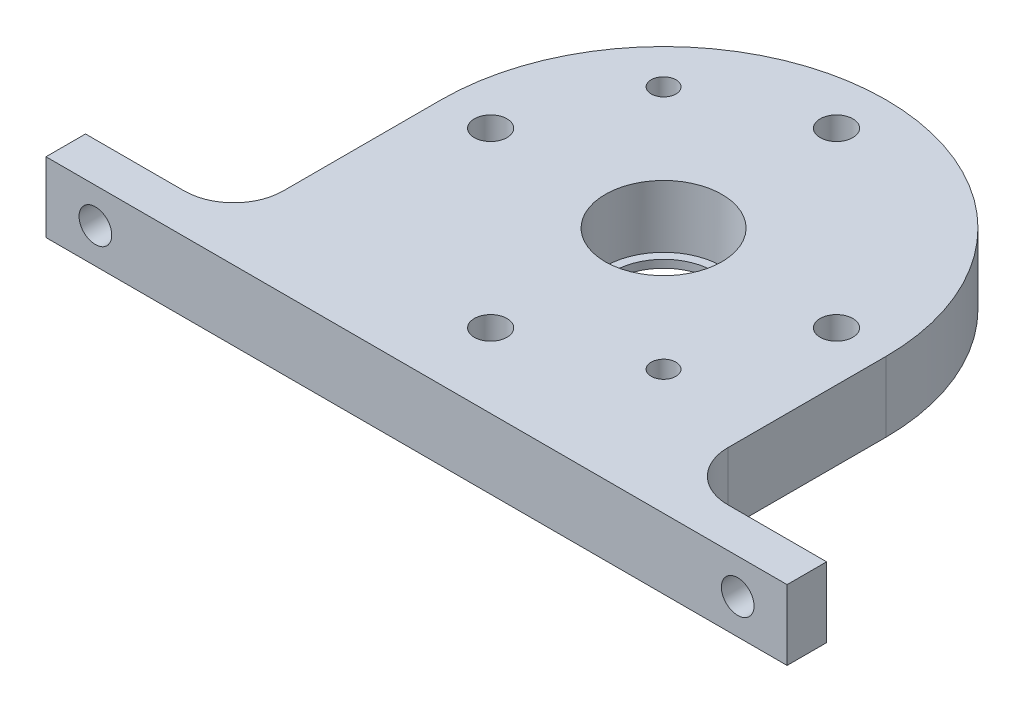
ISO-10303-21;
HEADER;
FILE_DESCRIPTION(('STEP AP214'),'2;1');
FILE_NAME('part.step','',(''),(''),'','','');
FILE_SCHEMA(('AUTOMOTIVE_DESIGN { 1 0 10303 214 1 1 1 1 }'));
ENDSEC;
DATA;
#1=APPLICATION_CONTEXT('core data for automotive mechanical design processes');
#2=APPLICATION_PROTOCOL_DEFINITION('international standard','automotive_design',2000,#1);
#3=PRODUCT_CONTEXT('',#1,'mechanical');
#4=PRODUCT('Part','Part','',(#3));
#5=PRODUCT_RELATED_PRODUCT_CATEGORY('part','',(#4));
#6=PRODUCT_DEFINITION_FORMATION('','',#4);
#7=PRODUCT_DEFINITION_CONTEXT('part definition',#1,'design');
#8=PRODUCT_DEFINITION('design','',#6,#7);
#9=PRODUCT_DEFINITION_SHAPE('','',#8);
#10=(LENGTH_UNIT() NAMED_UNIT(*) SI_UNIT(.MILLI.,.METRE.));
#11=(NAMED_UNIT(*) PLANE_ANGLE_UNIT() SI_UNIT($,.RADIAN.));
#12=(NAMED_UNIT(*) SI_UNIT($,.STERADIAN.) SOLID_ANGLE_UNIT());
#13=UNCERTAINTY_MEASURE_WITH_UNIT(LENGTH_MEASURE(1.E-05),#10,'distance_accuracy_value','');
#14=(GEOMETRIC_REPRESENTATION_CONTEXT(3) GLOBAL_UNCERTAINTY_ASSIGNED_CONTEXT((#13)) GLOBAL_UNIT_ASSIGNED_CONTEXT((#10,
#11,#12)) REPRESENTATION_CONTEXT('',''));
#15=CARTESIAN_POINT('',(0.,0.,0.));
#16=DIRECTION('',(0.,0.,1.));
#17=DIRECTION('',(1.,0.,0.));
#18=AXIS2_PLACEMENT_3D('',#15,#16,#17);
#19=CARTESIAN_POINT('',(0.,175.644610179245,0.));
#20=DIRECTION('',(0.,-1.,0.));
#21=DIRECTION('',(0.,0.,-1.));
#22=AXIS2_PLACEMENT_3D('',#19,#20,#21);
#23=CYLINDRICAL_SURFACE('',#22,57.15);
#24=CARTESIAN_POINT('',(0.,16.,0.));
#25=DIRECTION('',(0.,1.,0.));
#26=DIRECTION('',(0.,0.,1.));
#27=AXIS2_PLACEMENT_3D('',#24,#25,#26);
#28=CIRCLE('',#27,57.15);
#29=CARTESIAN_POINT('',(57.15,16.,0.));
#30=VERTEX_POINT('',#29);
#31=CARTESIAN_POINT('',(-57.15,16.,0.));
#32=VERTEX_POINT('',#31);
#33=EDGE_CURVE('E238',#30,#32,#28,.T.);
#34=ORIENTED_EDGE('',*,*,#33,.F.);
#35=DIRECTION('',(0.,1.,0.));
#36=VECTOR('',#35,1.);
#37=CARTESIAN_POINT('',(57.15,-202.804631420692,0.));
#38=LINE('',#37,#36);
#39=CARTESIAN_POINT('',(57.15,-2.,0.));
#40=VERTEX_POINT('',#39);
#41=EDGE_CURVE('E174',#40,#30,#38,.T.);
#42=ORIENTED_EDGE('',*,*,#41,.F.);
#43=CARTESIAN_POINT('',(0.,-2.,0.));
#44=DIRECTION('',(0.,-1.,0.));
#45=DIRECTION('',(0.,0.,-1.));
#46=AXIS2_PLACEMENT_3D('',#43,#44,#45);
#47=CIRCLE('',#46,57.15);
#48=CARTESIAN_POINT('',(-57.15,-2.,0.));
#49=VERTEX_POINT('',#48);
#50=EDGE_CURVE('E53',#49,#40,#47,.T.);
#51=ORIENTED_EDGE('',*,*,#50,.F.);
#52=DIRECTION('',(0.,1.,0.));
#53=VECTOR('',#52,1.);
#54=CARTESIAN_POINT('',(-57.15,-202.804631420692,0.));
#55=LINE('',#54,#53);
#56=EDGE_CURVE('E171',#49,#32,#55,.T.);
#57=ORIENTED_EDGE('',*,*,#56,.T.);
#58=EDGE_LOOP('',(#34,#42,#51,#57));
#59=FACE_BOUND('',#58,.T.);
#60=ADVANCED_FACE('F46',(#59),#23,.T.);
#61=CARTESIAN_POINT('',(0.,-42.4264068711929,0.));
#62=DIRECTION('',(0.,1.,0.));
#63=DIRECTION('',(0.,0.,1.));
#64=AXIS2_PLACEMENT_3D('',#61,#62,#63);
#65=CYLINDRICAL_SURFACE('',#64,15.);
#66=CARTESIAN_POINT('',(0.,0.,0.));
#67=DIRECTION('',(0.,-1.,0.));
#68=DIRECTION('',(0.,0.,-1.));
#69=AXIS2_PLACEMENT_3D('',#66,#67,#68);
#70=CIRCLE('',#69,15.);
#71=CARTESIAN_POINT('',(0.,0.,-15.));
#72=VERTEX_POINT('',#71);
#73=EDGE_CURVE('E13',#72,#72,#70,.F.);
#74=ORIENTED_EDGE('',*,*,#73,.F.);
#75=EDGE_LOOP('',(#74));
#76=FACE_BOUND('',#75,.T.);
#77=CARTESIAN_POINT('',(0.,16.,0.));
#78=DIRECTION('',(0.,1.,0.));
#79=DIRECTION('',(0.,0.,1.));
#80=AXIS2_PLACEMENT_3D('',#77,#78,#79);
#81=CIRCLE('',#80,15.);
#82=CARTESIAN_POINT('',(0.,16.,15.));
#83=VERTEX_POINT('',#82);
#84=EDGE_CURVE('E235',#83,#83,#81,.T.);
#85=ORIENTED_EDGE('',*,*,#84,.T.);
#86=EDGE_LOOP('',(#85));
#87=FACE_BOUND('',#86,.T.);
#88=ADVANCED_FACE('F308',(#76,#87),#65,.F.);
#89=CARTESIAN_POINT('',(0.,0.,0.));
#90=DIRECTION('',(0.,-1.,0.));
#91=DIRECTION('',(0.,0.,-1.));
#92=AXIS2_PLACEMENT_3D('',#89,#90,#91);
#93=PLANE('',#92);
#94=CARTESIAN_POINT('',(0.,0.,0.));
#95=DIRECTION('',(0.,-1.,0.));
#96=DIRECTION('',(0.,0.,-1.));
#97=AXIS2_PLACEMENT_3D('',#94,#95,#96);
#98=CIRCLE('',#97,12.8);
#99=CARTESIAN_POINT('',(0.,0.,-12.8));
#100=VERTEX_POINT('',#99);
#101=EDGE_CURVE('E240',#100,#100,#98,.T.);
#102=ORIENTED_EDGE('',*,*,#101,.T.);
#103=EDGE_LOOP('',(#102));
#104=FACE_BOUND('',#103,.T.);
#105=ORIENTED_EDGE('',*,*,#73,.T.);
#106=EDGE_LOOP('',(#105));
#107=FACE_BOUND('',#106,.T.);
#108=ADVANCED_FACE('F312',(#104,#107),#93,.F.);
#109=CARTESIAN_POINT('',(0.,-2.,0.));
#110=DIRECTION('',(0.,-1.,0.));
#111=DIRECTION('',(0.,0.,-1.));
#112=AXIS2_PLACEMENT_3D('',#109,#110,#111);
#113=PLANE('',#112);
#114=CARTESIAN_POINT('',(31.4308964237421,-2.,31.430896423742));
#115=DIRECTION('',(0.,1.,0.));
#116=DIRECTION('',(0.,0.,1.));
#117=AXIS2_PLACEMENT_3D('',#114,#115,#116);
#118=CIRCLE('',#117,3.17499999999999);
#119=CARTESIAN_POINT('',(31.4308964237421,-2.,34.6058964237419));
#120=VERTEX_POINT('',#119);
#121=EDGE_CURVE('E202',#120,#120,#118,.T.);
#122=ORIENTED_EDGE('',*,*,#121,.T.);
#123=EDGE_LOOP('',(#122));
#124=FACE_BOUND('',#123,.T.);
#125=CARTESIAN_POINT('',(-31.4308964237421,-2.,-31.430896423742));
#126=DIRECTION('',(0.,1.,0.));
#127=DIRECTION('',(0.,0.,1.));
#128=AXIS2_PLACEMENT_3D('',#125,#126,#127);
#129=CIRCLE('',#128,3.17499999999999);
#130=CARTESIAN_POINT('',(-31.4308964237421,-2.,-28.255896423742));
#131=VERTEX_POINT('',#130);
#132=EDGE_CURVE('E208',#131,#131,#129,.T.);
#133=ORIENTED_EDGE('',*,*,#132,.T.);
#134=EDGE_LOOP('',(#133));
#135=FACE_BOUND('',#134,.T.);
#136=CARTESIAN_POINT('',(0.,-2.,-44.45));
#137=DIRECTION('',(0.,1.,0.));
#138=DIRECTION('',(0.,0.,1.));
#139=AXIS2_PLACEMENT_3D('',#136,#137,#138);
#140=CIRCLE('',#139,4.19999999999999);
#141=CARTESIAN_POINT('',(0.,-2.,-40.25));
#142=VERTEX_POINT('',#141);
#143=EDGE_CURVE('E214',#142,#142,#140,.T.);
#144=ORIENTED_EDGE('',*,*,#143,.T.);
#145=EDGE_LOOP('',(#144));
#146=FACE_BOUND('',#145,.T.);
#147=CARTESIAN_POINT('',(44.4500000000025,-2.,-2.52124641334071E-12));
#148=DIRECTION('',(0.,1.,0.));
#149=DIRECTION('',(0.,0.,1.));
#150=AXIS2_PLACEMENT_3D('',#147,#148,#149);
#151=CIRCLE('',#150,4.19999999999999);
#152=CARTESIAN_POINT('',(44.4500000000025,-2.,4.19999999999747));
#153=VERTEX_POINT('',#152);
#154=EDGE_CURVE('E220',#153,#153,#151,.T.);
#155=ORIENTED_EDGE('',*,*,#154,.T.);
#156=EDGE_LOOP('',(#155));
#157=FACE_BOUND('',#156,.T.);
#158=CARTESIAN_POINT('',(5.04249282668141E-12,-2.,44.45));
#159=DIRECTION('',(0.,1.,0.));
#160=DIRECTION('',(0.,0.,1.));
#161=AXIS2_PLACEMENT_3D('',#158,#159,#160);
#162=CIRCLE('',#161,4.19999999999999);
#163=CARTESIAN_POINT('',(5.04249282668141E-12,-2.,48.65));
#164=VERTEX_POINT('',#163);
#165=EDGE_CURVE('E226',#164,#164,#162,.T.);
#166=ORIENTED_EDGE('',*,*,#165,.T.);
#167=EDGE_LOOP('',(#166));
#168=FACE_BOUND('',#167,.T.);
#169=CARTESIAN_POINT('',(-44.4499999999975,-2.,2.5158028583185E-12));
#170=DIRECTION('',(0.,1.,0.));
#171=DIRECTION('',(0.,0.,1.));
#172=AXIS2_PLACEMENT_3D('',#169,#170,#171);
#173=CIRCLE('',#172,4.19999999999999);
#174=CARTESIAN_POINT('',(-44.4499999999975,-2.,4.2000000000025));
#175=VERTEX_POINT('',#174);
#176=EDGE_CURVE('E232',#175,#175,#173,.T.);
#177=ORIENTED_EDGE('',*,*,#176,.T.);
#178=EDGE_LOOP('',(#177));
#179=FACE_BOUND('',#178,.T.);
#180=ORIENTED_EDGE('',*,*,#50,.T.);
#181=DIRECTION('',(0.,0.,-1.));
#182=VECTOR('',#181,1.);
#183=CARTESIAN_POINT('',(57.15,-2.,0.));
#184=LINE('',#183,#182);
#185=CARTESIAN_POINT('',(57.15,-2.,40.64));
#186=VERTEX_POINT('',#185);
#187=EDGE_CURVE('E172',#186,#40,#184,.T.);
#188=ORIENTED_EDGE('',*,*,#187,.F.);
#189=CARTESIAN_POINT('',(69.85,-2.,40.64));
#190=DIRECTION('',(0.,-1.,0.));
#191=DIRECTION('',(0.,0.,-1.));
#192=AXIS2_PLACEMENT_3D('',#189,#190,#191);
#193=CIRCLE('',#192,12.7);
#194=CARTESIAN_POINT('',(69.85,-2.,53.34));
#195=VERTEX_POINT('',#194);
#196=EDGE_CURVE('E176',#195,#186,#193,.T.);
#197=ORIENTED_EDGE('',*,*,#196,.F.);
#198=DIRECTION('',(-1.,0.,0.));
#199=VECTOR('',#198,1.);
#200=CARTESIAN_POINT('',(95.25,-2.,53.34));
#201=LINE('',#200,#199);
#202=CARTESIAN_POINT('',(95.25,-2.,53.34));
#203=VERTEX_POINT('',#202);
#204=EDGE_CURVE('E180',#203,#195,#201,.T.);
#205=ORIENTED_EDGE('',*,*,#204,.F.);
#206=DIRECTION('',(0.,0.,-1.));
#207=VECTOR('',#206,1.);
#208=CARTESIAN_POINT('',(95.25,-2.,63.5));
#209=LINE('',#208,#207);
#210=CARTESIAN_POINT('',(95.25,-2.,63.5));
#211=VERTEX_POINT('',#210);
#212=EDGE_CURVE('E184',#211,#203,#209,.T.);
#213=ORIENTED_EDGE('',*,*,#212,.F.);
#214=DIRECTION('',(1.,0.,0.));
#215=VECTOR('',#214,1.);
#216=CARTESIAN_POINT('',(57.15,-2.,63.5));
#217=LINE('',#216,#215);
#218=CARTESIAN_POINT('',(-95.25,-2.,63.5));
#219=VERTEX_POINT('',#218);
#220=EDGE_CURVE('E140',#219,#211,#217,.T.);
#221=ORIENTED_EDGE('',*,*,#220,.F.);
#222=DIRECTION('',(0.,0.,1.));
#223=VECTOR('',#222,1.);
#224=CARTESIAN_POINT('',(-95.25,-2.,63.5));
#225=LINE('',#224,#223);
#226=CARTESIAN_POINT('',(-95.25,-2.,53.34));
#227=VERTEX_POINT('',#226);
#228=EDGE_CURVE('E112',#227,#219,#225,.T.);
#229=ORIENTED_EDGE('',*,*,#228,.F.);
#230=DIRECTION('',(-1.,0.,0.));
#231=VECTOR('',#230,1.);
#232=CARTESIAN_POINT('',(-95.25,-2.,53.34));
#233=LINE('',#232,#231);
#234=CARTESIAN_POINT('',(-69.85,-2.,53.34));
#235=VERTEX_POINT('',#234);
#236=EDGE_CURVE('E107',#235,#227,#233,.T.);
#237=ORIENTED_EDGE('',*,*,#236,.F.);
#238=CARTESIAN_POINT('',(-69.85,-2.,40.64));
#239=DIRECTION('',(0.,-1.,0.));
#240=DIRECTION('',(0.,0.,-1.));
#241=AXIS2_PLACEMENT_3D('',#238,#239,#240);
#242=CIRCLE('',#241,12.7);
#243=CARTESIAN_POINT('',(-57.15,-2.,40.64));
#244=VERTEX_POINT('',#243);
#245=EDGE_CURVE('E165',#244,#235,#242,.T.);
#246=ORIENTED_EDGE('',*,*,#245,.F.);
#247=DIRECTION('',(0.,0.,1.));
#248=VECTOR('',#247,1.);
#249=CARTESIAN_POINT('',(-57.15,-2.,0.));
#250=LINE('',#249,#248);
#251=EDGE_CURVE('E168',#49,#244,#250,.T.);
#252=ORIENTED_EDGE('',*,*,#251,.F.);
#253=EDGE_LOOP('',(#180,#188,#197,#205,#213,#221,#229,#237,#246,#252));
#254=FACE_BOUND('',#253,.T.);
#255=CARTESIAN_POINT('',(0.,-2.,0.));
#256=DIRECTION('',(0.,-1.,0.));
#257=DIRECTION('',(0.,0.,-1.));
#258=AXIS2_PLACEMENT_3D('',#255,#256,#257);
#259=CIRCLE('',#258,12.8);
#260=CARTESIAN_POINT('',(0.,-2.,-12.8));
#261=VERTEX_POINT('',#260);
#262=EDGE_CURVE('E241',#261,#261,#259,.T.);
#263=ORIENTED_EDGE('',*,*,#262,.F.);
#264=EDGE_LOOP('',(#263));
#265=FACE_BOUND('',#264,.T.);
#266=ADVANCED_FACE('F247',(#124,#135,#146,#157,#168,#179,#254,#265),#113,.T.);
#267=CARTESIAN_POINT('',(0.,-2.,0.));
#268=DIRECTION('',(0.,1.,0.));
#269=DIRECTION('',(0.,0.,1.));
#270=AXIS2_PLACEMENT_3D('',#267,#268,#269);
#271=CYLINDRICAL_SURFACE('',#270,12.8);
#272=ORIENTED_EDGE('',*,*,#262,.T.);
#273=EDGE_LOOP('',(#272));
#274=FACE_BOUND('',#273,.T.);
#275=ORIENTED_EDGE('',*,*,#101,.F.);
#276=EDGE_LOOP('',(#275));
#277=FACE_BOUND('',#276,.T.);
#278=ADVANCED_FACE('F324',(#274,#277),#271,.F.);
#279=CARTESIAN_POINT('',(0.,16.,0.));
#280=DIRECTION('',(0.,1.,0.));
#281=DIRECTION('',(0.,0.,1.));
#282=AXIS2_PLACEMENT_3D('',#279,#280,#281);
#283=PLANE('',#282);
#284=CARTESIAN_POINT('',(31.4308964237421,16.,31.430896423742));
#285=DIRECTION('',(0.,1.,0.));
#286=DIRECTION('',(0.,0.,1.));
#287=AXIS2_PLACEMENT_3D('',#284,#285,#286);
#288=CIRCLE('',#287,3.175);
#289=CARTESIAN_POINT('',(31.4308964237421,16.,34.605896423742));
#290=VERTEX_POINT('',#289);
#291=EDGE_CURVE('E199',#290,#290,#288,.T.);
#292=ORIENTED_EDGE('',*,*,#291,.F.);
#293=EDGE_LOOP('',(#292));
#294=FACE_BOUND('',#293,.T.);
#295=CARTESIAN_POINT('',(-31.4308964237421,16.,-31.430896423742));
#296=DIRECTION('',(0.,1.,0.));
#297=DIRECTION('',(0.,0.,1.));
#298=AXIS2_PLACEMENT_3D('',#295,#296,#297);
#299=CIRCLE('',#298,3.175);
#300=CARTESIAN_POINT('',(-31.4308964237421,16.,-28.255896423742));
#301=VERTEX_POINT('',#300);
#302=EDGE_CURVE('E205',#301,#301,#299,.T.);
#303=ORIENTED_EDGE('',*,*,#302,.F.);
#304=EDGE_LOOP('',(#303));
#305=FACE_BOUND('',#304,.T.);
#306=CARTESIAN_POINT('',(0.,16.,-44.45));
#307=DIRECTION('',(0.,1.,0.));
#308=DIRECTION('',(0.,0.,1.));
#309=AXIS2_PLACEMENT_3D('',#306,#307,#308);
#310=CIRCLE('',#309,4.2);
#311=CARTESIAN_POINT('',(0.,16.,-40.25));
#312=VERTEX_POINT('',#311);
#313=EDGE_CURVE('E211',#312,#312,#310,.T.);
#314=ORIENTED_EDGE('',*,*,#313,.F.);
#315=EDGE_LOOP('',(#314));
#316=FACE_BOUND('',#315,.T.);
#317=CARTESIAN_POINT('',(44.4500000000025,16.,-2.52124641334071E-12));
#318=DIRECTION('',(0.,1.,0.));
#319=DIRECTION('',(0.,0.,1.));
#320=AXIS2_PLACEMENT_3D('',#317,#318,#319);
#321=CIRCLE('',#320,4.2);
#322=CARTESIAN_POINT('',(44.4500000000025,16.,4.19999999999747));
#323=VERTEX_POINT('',#322);
#324=EDGE_CURVE('E217',#323,#323,#321,.T.);
#325=ORIENTED_EDGE('',*,*,#324,.F.);
#326=EDGE_LOOP('',(#325));
#327=FACE_BOUND('',#326,.T.);
#328=CARTESIAN_POINT('',(5.04249282668141E-12,16.,44.45));
#329=DIRECTION('',(0.,1.,0.));
#330=DIRECTION('',(0.,0.,1.));
#331=AXIS2_PLACEMENT_3D('',#328,#329,#330);
#332=CIRCLE('',#331,4.2);
#333=CARTESIAN_POINT('',(5.04249282668141E-12,16.,48.65));
#334=VERTEX_POINT('',#333);
#335=EDGE_CURVE('E223',#334,#334,#332,.T.);
#336=ORIENTED_EDGE('',*,*,#335,.F.);
#337=EDGE_LOOP('',(#336));
#338=FACE_BOUND('',#337,.T.);
#339=CARTESIAN_POINT('',(-44.4499999999975,16.,2.5158028583185E-12));
#340=DIRECTION('',(0.,1.,0.));
#341=DIRECTION('',(0.,0.,1.));
#342=AXIS2_PLACEMENT_3D('',#339,#340,#341);
#343=CIRCLE('',#342,4.2);
#344=CARTESIAN_POINT('',(-44.4499999999975,16.,4.20000000000251));
#345=VERTEX_POINT('',#344);
#346=EDGE_CURVE('E229',#345,#345,#343,.T.);
#347=ORIENTED_EDGE('',*,*,#346,.F.);
#348=EDGE_LOOP('',(#347));
#349=FACE_BOUND('',#348,.T.);
#350=ORIENTED_EDGE('',*,*,#33,.T.);
#351=DIRECTION('',(0.,0.,1.));
#352=VECTOR('',#351,1.);
#353=CARTESIAN_POINT('',(-57.15,16.,0.));
#354=LINE('',#353,#352);
#355=CARTESIAN_POINT('',(-57.15,16.,40.64));
#356=VERTEX_POINT('',#355);
#357=EDGE_CURVE('E164',#32,#356,#354,.T.);
#358=ORIENTED_EDGE('',*,*,#357,.T.);
#359=CARTESIAN_POINT('',(-69.85,16.,40.64));
#360=DIRECTION('',(0.,-1.,0.));
#361=DIRECTION('',(0.,0.,1.));
#362=AXIS2_PLACEMENT_3D('',#359,#360,#361);
#363=CIRCLE('',#362,12.7);
#364=CARTESIAN_POINT('',(-69.85,16.,53.34));
#365=VERTEX_POINT('',#364);
#366=EDGE_CURVE('E156',#356,#365,#363,.T.);
#367=ORIENTED_EDGE('',*,*,#366,.T.);
#368=DIRECTION('',(-1.,0.,0.));
#369=VECTOR('',#368,1.);
#370=CARTESIAN_POINT('',(-95.25,16.,53.34));
#371=LINE('',#370,#369);
#372=CARTESIAN_POINT('',(-95.25,16.,53.34));
#373=VERTEX_POINT('',#372);
#374=EDGE_CURVE('E154',#365,#373,#371,.T.);
#375=ORIENTED_EDGE('',*,*,#374,.T.);
#376=DIRECTION('',(0.,0.,1.));
#377=VECTOR('',#376,1.);
#378=CARTESIAN_POINT('',(-95.25,16.,63.5));
#379=LINE('',#378,#377);
#380=CARTESIAN_POINT('',(-95.25,16.,63.5));
#381=VERTEX_POINT('',#380);
#382=EDGE_CURVE('E136',#373,#381,#379,.T.);
#383=ORIENTED_EDGE('',*,*,#382,.T.);
#384=DIRECTION('',(1.,0.,0.));
#385=VECTOR('',#384,1.);
#386=CARTESIAN_POINT('',(57.15,16.,63.5));
#387=LINE('',#386,#385);
#388=CARTESIAN_POINT('',(95.25,16.,63.5));
#389=VERTEX_POINT('',#388);
#390=EDGE_CURVE('E143',#381,#389,#387,.T.);
#391=ORIENTED_EDGE('',*,*,#390,.T.);
#392=DIRECTION('',(0.,0.,-1.));
#393=VECTOR('',#392,1.);
#394=CARTESIAN_POINT('',(95.25,16.,63.5));
#395=LINE('',#394,#393);
#396=CARTESIAN_POINT('',(95.25,16.,53.34));
#397=VERTEX_POINT('',#396);
#398=EDGE_CURVE('E149',#389,#397,#395,.T.);
#399=ORIENTED_EDGE('',*,*,#398,.T.);
#400=DIRECTION('',(-1.,0.,0.));
#401=VECTOR('',#400,1.);
#402=CARTESIAN_POINT('',(95.25,16.,53.34));
#403=LINE('',#402,#401);
#404=CARTESIAN_POINT('',(69.85,16.,53.34));
#405=VERTEX_POINT('',#404);
#406=EDGE_CURVE('E265',#397,#405,#403,.T.);
#407=ORIENTED_EDGE('',*,*,#406,.T.);
#408=CARTESIAN_POINT('',(69.85,16.,40.64));
#409=DIRECTION('',(0.,-1.,0.));
#410=DIRECTION('',(0.,0.,-1.));
#411=AXIS2_PLACEMENT_3D('',#408,#409,#410);
#412=CIRCLE('',#411,12.7);
#413=CARTESIAN_POINT('',(57.15,16.,40.64));
#414=VERTEX_POINT('',#413);
#415=EDGE_CURVE('E268',#405,#414,#412,.T.);
#416=ORIENTED_EDGE('',*,*,#415,.T.);
#417=DIRECTION('',(0.,0.,-1.));
#418=VECTOR('',#417,1.);
#419=CARTESIAN_POINT('',(57.15,16.,0.));
#420=LINE('',#419,#418);
#421=EDGE_CURVE('E60',#414,#30,#420,.T.);
#422=ORIENTED_EDGE('',*,*,#421,.T.);
#423=EDGE_LOOP('',(#350,#358,#367,#375,#383,#391,#399,#407,#416,#422));
#424=FACE_BOUND('',#423,.T.);
#425=ORIENTED_EDGE('',*,*,#84,.F.);
#426=EDGE_LOOP('',(#425));
#427=FACE_BOUND('',#426,.T.);
#428=ADVANCED_FACE('F151',(#294,#305,#316,#327,#338,#349,#424,#427),#283,.T.);
#429=CARTESIAN_POINT('',(-44.4499999999975,16.,2.5158028583185E-12));
#430=DIRECTION('',(0.,1.,0.));
#431=DIRECTION('',(0.,0.,1.));
#432=AXIS2_PLACEMENT_3D('',#429,#430,#431);
#433=CYLINDRICAL_SURFACE('',#432,4.19999999999999);
#434=ORIENTED_EDGE('',*,*,#176,.F.);
#435=EDGE_LOOP('',(#434));
#436=FACE_BOUND('',#435,.T.);
#437=ORIENTED_EDGE('',*,*,#346,.T.);
#438=EDGE_LOOP('',(#437));
#439=FACE_BOUND('',#438,.T.);
#440=ADVANCED_FACE('F331',(#436,#439),#433,.F.);
#441=CARTESIAN_POINT('',(5.04249282668141E-12,16.,44.45));
#442=DIRECTION('',(0.,1.,0.));
#443=DIRECTION('',(0.,0.,1.));
#444=AXIS2_PLACEMENT_3D('',#441,#442,#443);
#445=CYLINDRICAL_SURFACE('',#444,4.2);
#446=ORIENTED_EDGE('',*,*,#165,.F.);
#447=EDGE_LOOP('',(#446));
#448=FACE_BOUND('',#447,.T.);
#449=ORIENTED_EDGE('',*,*,#335,.T.);
#450=EDGE_LOOP('',(#449));
#451=FACE_BOUND('',#450,.T.);
#452=ADVANCED_FACE('F335',(#448,#451),#445,.F.);
#453=CARTESIAN_POINT('',(44.4500000000025,16.,-2.52124641334071E-12));
#454=DIRECTION('',(0.,1.,0.));
#455=DIRECTION('',(0.,0.,1.));
#456=AXIS2_PLACEMENT_3D('',#453,#454,#455);
#457=CYLINDRICAL_SURFACE('',#456,4.19999999999999);
#458=ORIENTED_EDGE('',*,*,#154,.F.);
#459=EDGE_LOOP('',(#458));
#460=FACE_BOUND('',#459,.T.);
#461=ORIENTED_EDGE('',*,*,#324,.T.);
#462=EDGE_LOOP('',(#461));
#463=FACE_BOUND('',#462,.T.);
#464=ADVANCED_FACE('F339',(#460,#463),#457,.F.);
#465=CARTESIAN_POINT('',(0.,16.,-44.45));
#466=DIRECTION('',(0.,1.,0.));
#467=DIRECTION('',(0.,0.,1.));
#468=AXIS2_PLACEMENT_3D('',#465,#466,#467);
#469=CYLINDRICAL_SURFACE('',#468,4.2);
#470=ORIENTED_EDGE('',*,*,#143,.F.);
#471=EDGE_LOOP('',(#470));
#472=FACE_BOUND('',#471,.T.);
#473=ORIENTED_EDGE('',*,*,#313,.T.);
#474=EDGE_LOOP('',(#473));
#475=FACE_BOUND('',#474,.T.);
#476=ADVANCED_FACE('F343',(#472,#475),#469,.F.);
#477=CARTESIAN_POINT('',(-31.4308964237421,16.,-31.430896423742));
#478=DIRECTION('',(0.,1.,0.));
#479=DIRECTION('',(0.,0.,1.));
#480=AXIS2_PLACEMENT_3D('',#477,#478,#479);
#481=CYLINDRICAL_SURFACE('',#480,3.17499999999999);
#482=ORIENTED_EDGE('',*,*,#132,.F.);
#483=EDGE_LOOP('',(#482));
#484=FACE_BOUND('',#483,.T.);
#485=ORIENTED_EDGE('',*,*,#302,.T.);
#486=EDGE_LOOP('',(#485));
#487=FACE_BOUND('',#486,.T.);
#488=ADVANCED_FACE('F347',(#484,#487),#481,.F.);
#489=CARTESIAN_POINT('',(31.4308964237421,16.,31.430896423742));
#490=DIRECTION('',(0.,1.,0.));
#491=DIRECTION('',(0.,0.,1.));
#492=AXIS2_PLACEMENT_3D('',#489,#490,#491);
#493=CYLINDRICAL_SURFACE('',#492,3.17499999999999);
#494=ORIENTED_EDGE('',*,*,#121,.F.);
#495=EDGE_LOOP('',(#494));
#496=FACE_BOUND('',#495,.T.);
#497=ORIENTED_EDGE('',*,*,#291,.T.);
#498=EDGE_LOOP('',(#497));
#499=FACE_BOUND('',#498,.T.);
#500=ADVANCED_FACE('F292',(#496,#499),#493,.F.);
#501=CARTESIAN_POINT('',(-95.25,-202.804631420692,53.34));
#502=DIRECTION('',(0.,0.,-1.));
#503=DIRECTION('',(-1.,0.,0.));
#504=AXIS2_PLACEMENT_3D('',#501,#502,#503);
#505=PLANE('',#504);
#506=CARTESIAN_POINT('',(-82.55,7.,53.34));
#507=DIRECTION('',(0.,0.,-1.));
#508=DIRECTION('',(-1.,0.,0.));
#509=AXIS2_PLACEMENT_3D('',#506,#507,#508);
#510=CIRCLE('',#509,4.2);
#511=CARTESIAN_POINT('',(-86.75,7.,53.34));
#512=VERTEX_POINT('',#511);
#513=EDGE_CURVE('E283',#512,#512,#510,.T.);
#514=ORIENTED_EDGE('',*,*,#513,.F.);
#515=EDGE_LOOP('',(#514));
#516=FACE_BOUND('',#515,.T.);
#517=DIRECTION('',(0.,1.,0.));
#518=VECTOR('',#517,1.);
#519=CARTESIAN_POINT('',(-69.85,-202.804631420692,53.34));
#520=LINE('',#519,#518);
#521=EDGE_CURVE('E69',#235,#365,#520,.T.);
#522=ORIENTED_EDGE('',*,*,#521,.F.);
#523=ORIENTED_EDGE('',*,*,#236,.T.);
#524=DIRECTION('',(0.,1.,0.));
#525=VECTOR('',#524,1.);
#526=CARTESIAN_POINT('',(-95.25,-202.804631420692,53.34));
#527=LINE('',#526,#525);
#528=EDGE_CURVE('E163',#227,#373,#527,.T.);
#529=ORIENTED_EDGE('',*,*,#528,.T.);
#530=ORIENTED_EDGE('',*,*,#374,.F.);
#531=EDGE_LOOP('',(#522,#523,#529,#530));
#532=FACE_BOUND('',#531,.T.);
#533=ADVANCED_FACE('F289',(#516,#532),#505,.T.);
#534=CARTESIAN_POINT('',(-95.25,-202.804631420692,63.5));
#535=DIRECTION('',(-1.,0.,0.));
#536=DIRECTION('',(0.,0.,1.));
#537=AXIS2_PLACEMENT_3D('',#534,#535,#536);
#538=PLANE('',#537);
#539=ORIENTED_EDGE('',*,*,#528,.F.);
#540=ORIENTED_EDGE('',*,*,#228,.T.);
#541=DIRECTION('',(0.,1.,0.));
#542=VECTOR('',#541,1.);
#543=CARTESIAN_POINT('',(-95.25,-202.804631420692,63.5));
#544=LINE('',#543,#542);
#545=EDGE_CURVE('E132',#219,#381,#544,.T.);
#546=ORIENTED_EDGE('',*,*,#545,.T.);
#547=ORIENTED_EDGE('',*,*,#382,.F.);
#548=EDGE_LOOP('',(#539,#540,#546,#547));
#549=FACE_BOUND('',#548,.T.);
#550=ADVANCED_FACE('F134',(#549),#538,.T.);
#551=CARTESIAN_POINT('',(57.15,-202.804631420692,63.5));
#552=DIRECTION('',(0.,0.,1.));
#553=DIRECTION('',(1.,0.,0.));
#554=AXIS2_PLACEMENT_3D('',#551,#552,#553);
#555=PLANE('',#554);
#556=CARTESIAN_POINT('',(-82.55,7.,63.5));
#557=DIRECTION('',(0.,0.,-1.));
#558=DIRECTION('',(-1.,0.,0.));
#559=AXIS2_PLACEMENT_3D('',#556,#557,#558);
#560=CIRCLE('',#559,4.19999999999997);
#561=CARTESIAN_POINT('',(-86.75,7.,63.5));
#562=VERTEX_POINT('',#561);
#563=EDGE_CURVE('E280',#562,#562,#560,.T.);
#564=ORIENTED_EDGE('',*,*,#563,.T.);
#565=EDGE_LOOP('',(#564));
#566=FACE_BOUND('',#565,.T.);
#567=CARTESIAN_POINT('',(82.55,7.,63.5));
#568=DIRECTION('',(0.,0.,-1.));
#569=DIRECTION('',(-1.,0.,0.));
#570=AXIS2_PLACEMENT_3D('',#567,#568,#569);
#571=CIRCLE('',#570,4.19999999999997);
#572=CARTESIAN_POINT('',(78.3500000000001,7.,63.5));
#573=VERTEX_POINT('',#572);
#574=EDGE_CURVE('E161',#573,#573,#571,.T.);
#575=ORIENTED_EDGE('',*,*,#574,.T.);
#576=EDGE_LOOP('',(#575));
#577=FACE_BOUND('',#576,.T.);
#578=ORIENTED_EDGE('',*,*,#545,.F.);
#579=ORIENTED_EDGE('',*,*,#220,.T.);
#580=DIRECTION('',(0.,1.,0.));
#581=VECTOR('',#580,1.);
#582=CARTESIAN_POINT('',(95.25,-202.804631420692,63.5));
#583=LINE('',#582,#581);
#584=EDGE_CURVE('E146',#211,#389,#583,.T.);
#585=ORIENTED_EDGE('',*,*,#584,.T.);
#586=ORIENTED_EDGE('',*,*,#390,.F.);
#587=EDGE_LOOP('',(#578,#579,#585,#586));
#588=FACE_BOUND('',#587,.T.);
#589=ADVANCED_FACE('F144',(#566,#577,#588),#555,.T.);
#590=CARTESIAN_POINT('',(95.25,-202.804631420692,63.5));
#591=DIRECTION('',(1.,0.,0.));
#592=DIRECTION('',(0.,0.,-1.));
#593=AXIS2_PLACEMENT_3D('',#590,#591,#592);
#594=PLANE('',#593);
#595=ORIENTED_EDGE('',*,*,#584,.F.);
#596=ORIENTED_EDGE('',*,*,#212,.T.);
#597=DIRECTION('',(0.,1.,0.));
#598=VECTOR('',#597,1.);
#599=CARTESIAN_POINT('',(95.25,-202.804631420692,53.34));
#600=LINE('',#599,#598);
#601=EDGE_CURVE('E183',#203,#397,#600,.T.);
#602=ORIENTED_EDGE('',*,*,#601,.T.);
#603=ORIENTED_EDGE('',*,*,#398,.F.);
#604=EDGE_LOOP('',(#595,#596,#602,#603));
#605=FACE_BOUND('',#604,.T.);
#606=ADVANCED_FACE('F267',(#605),#594,.T.);
#607=CARTESIAN_POINT('',(95.25,-202.804631420692,53.34));
#608=DIRECTION('',(0.,0.,-1.));
#609=DIRECTION('',(-1.,0.,0.));
#610=AXIS2_PLACEMENT_3D('',#607,#608,#609);
#611=PLANE('',#610);
#612=CARTESIAN_POINT('',(82.55,7.,53.34));
#613=DIRECTION('',(0.,0.,-1.));
#614=DIRECTION('',(-1.,0.,0.));
#615=AXIS2_PLACEMENT_3D('',#612,#613,#614);
#616=CIRCLE('',#615,4.2);
#617=CARTESIAN_POINT('',(78.3500000000001,7.,53.34));
#618=VERTEX_POINT('',#617);
#619=EDGE_CURVE('E277',#618,#618,#616,.T.);
#620=ORIENTED_EDGE('',*,*,#619,.F.);
#621=EDGE_LOOP('',(#620));
#622=FACE_BOUND('',#621,.T.);
#623=ORIENTED_EDGE('',*,*,#601,.F.);
#624=ORIENTED_EDGE('',*,*,#204,.T.);
#625=DIRECTION('',(0.,1.,0.));
#626=VECTOR('',#625,1.);
#627=CARTESIAN_POINT('',(69.85,-202.804631420692,53.34));
#628=LINE('',#627,#626);
#629=EDGE_CURVE('E179',#195,#405,#628,.T.);
#630=ORIENTED_EDGE('',*,*,#629,.T.);
#631=ORIENTED_EDGE('',*,*,#406,.F.);
#632=EDGE_LOOP('',(#623,#624,#630,#631));
#633=FACE_BOUND('',#632,.T.);
#634=ADVANCED_FACE('F263',(#622,#633),#611,.T.);
#635=CARTESIAN_POINT('',(69.85,-202.804631420692,40.64));
#636=DIRECTION('',(0.,1.,0.));
#637=DIRECTION('',(0.,0.,1.));
#638=AXIS2_PLACEMENT_3D('',#635,#636,#637);
#639=CYLINDRICAL_SURFACE('',#638,12.7);
#640=ORIENTED_EDGE('',*,*,#629,.F.);
#641=ORIENTED_EDGE('',*,*,#196,.T.);
#642=DIRECTION('',(0.,1.,0.));
#643=VECTOR('',#642,1.);
#644=CARTESIAN_POINT('',(57.15,-202.804631420692,40.64));
#645=LINE('',#644,#643);
#646=EDGE_CURVE('E175',#186,#414,#645,.T.);
#647=ORIENTED_EDGE('',*,*,#646,.T.);
#648=ORIENTED_EDGE('',*,*,#415,.F.);
#649=EDGE_LOOP('',(#640,#641,#647,#648));
#650=FACE_BOUND('',#649,.T.);
#651=ADVANCED_FACE('F259',(#650),#639,.F.);
#652=CARTESIAN_POINT('',(57.15,-202.804631420692,0.));
#653=DIRECTION('',(1.,0.,0.));
#654=DIRECTION('',(0.,0.,-1.));
#655=AXIS2_PLACEMENT_3D('',#652,#653,#654);
#656=PLANE('',#655);
#657=ORIENTED_EDGE('',*,*,#646,.F.);
#658=ORIENTED_EDGE('',*,*,#187,.T.);
#659=ORIENTED_EDGE('',*,*,#41,.T.);
#660=ORIENTED_EDGE('',*,*,#421,.F.);
#661=EDGE_LOOP('',(#657,#658,#659,#660));
#662=FACE_BOUND('',#661,.T.);
#663=ADVANCED_FACE('F255',(#662),#656,.T.);
#664=CARTESIAN_POINT('',(-57.15,-202.804631420692,0.));
#665=DIRECTION('',(-1.,0.,0.));
#666=DIRECTION('',(0.,0.,1.));
#667=AXIS2_PLACEMENT_3D('',#664,#665,#666);
#668=PLANE('',#667);
#669=ORIENTED_EDGE('',*,*,#56,.F.);
#670=ORIENTED_EDGE('',*,*,#251,.T.);
#671=DIRECTION('',(0.,1.,0.));
#672=VECTOR('',#671,1.);
#673=CARTESIAN_POINT('',(-57.15,-202.804631420692,40.64));
#674=LINE('',#673,#672);
#675=EDGE_CURVE('E167',#244,#356,#674,.T.);
#676=ORIENTED_EDGE('',*,*,#675,.T.);
#677=ORIENTED_EDGE('',*,*,#357,.F.);
#678=EDGE_LOOP('',(#669,#670,#676,#677));
#679=FACE_BOUND('',#678,.T.);
#680=ADVANCED_FACE('F297',(#679),#668,.T.);
#681=CARTESIAN_POINT('',(-69.85,-202.804631420692,40.64));
#682=DIRECTION('',(0.,1.,0.));
#683=DIRECTION('',(0.,0.,1.));
#684=AXIS2_PLACEMENT_3D('',#681,#682,#683);
#685=CYLINDRICAL_SURFACE('',#684,12.7);
#686=ORIENTED_EDGE('',*,*,#675,.F.);
#687=ORIENTED_EDGE('',*,*,#245,.T.);
#688=ORIENTED_EDGE('',*,*,#521,.T.);
#689=ORIENTED_EDGE('',*,*,#366,.F.);
#690=EDGE_LOOP('',(#686,#687,#688,#689));
#691=FACE_BOUND('',#690,.T.);
#692=ADVANCED_FACE('F295',(#691),#685,.F.);
#693=CARTESIAN_POINT('',(82.55,7.,53.34));
#694=DIRECTION('',(0.,0.,-1.));
#695=DIRECTION('',(-1.,0.,0.));
#696=AXIS2_PLACEMENT_3D('',#693,#694,#695);
#697=CYLINDRICAL_SURFACE('',#696,4.19999999999998);
#698=ORIENTED_EDGE('',*,*,#574,.F.);
#699=EDGE_LOOP('',(#698));
#700=FACE_BOUND('',#699,.T.);
#701=ORIENTED_EDGE('',*,*,#619,.T.);
#702=EDGE_LOOP('',(#701));
#703=FACE_BOUND('',#702,.T.);
#704=ADVANCED_FACE('F304',(#700,#703),#697,.F.);
#705=CARTESIAN_POINT('',(-82.55,7.,53.34));
#706=DIRECTION('',(0.,0.,-1.));
#707=DIRECTION('',(-1.,0.,0.));
#708=AXIS2_PLACEMENT_3D('',#705,#706,#707);
#709=CYLINDRICAL_SURFACE('',#708,4.19999999999998);
#710=ORIENTED_EDGE('',*,*,#563,.F.);
#711=EDGE_LOOP('',(#710));
#712=FACE_BOUND('',#711,.T.);
#713=ORIENTED_EDGE('',*,*,#513,.T.);
#714=EDGE_LOOP('',(#713));
#715=FACE_BOUND('',#714,.T.);
#716=ADVANCED_FACE('F287',(#712,#715),#709,.F.);
#717=CLOSED_SHELL('',(#60,#88,#108,#266,#278,#428,#440,#452,#464,#476,#488,#500,#533,#550,#589,
#606,#634,#651,#663,#680,#692,#704,#716));
#718=MANIFOLD_SOLID_BREP('B2',#717);
#719=ADVANCED_BREP_SHAPE_REPRESENTATION('',(#18,#718),#14);
#720=SHAPE_DEFINITION_REPRESENTATION(#9,#719);
ENDSEC;
END-ISO-10303-21;
